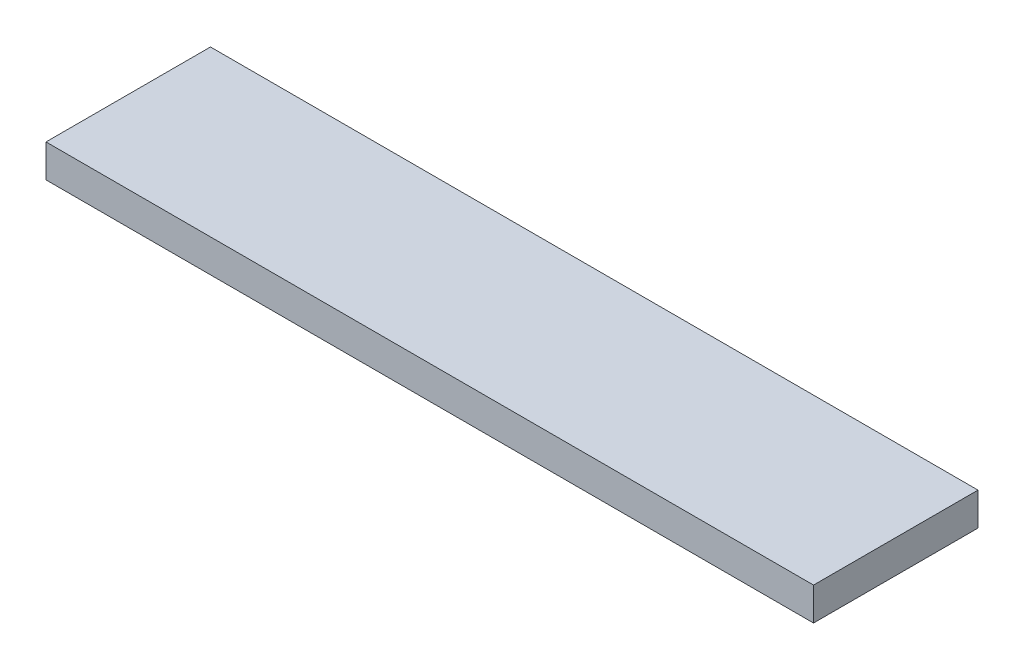
ISO-10303-21;
HEADER;
FILE_DESCRIPTION(('STEP AP214'),'2;1');
FILE_NAME('part.step','',(''),(''),'','','');
FILE_SCHEMA(('AUTOMOTIVE_DESIGN { 1 0 10303 214 1 1 1 1 }'));
ENDSEC;
DATA;
#1=APPLICATION_CONTEXT('core data for automotive mechanical design processes');
#2=APPLICATION_PROTOCOL_DEFINITION('international standard','automotive_design',2000,#1);
#3=PRODUCT_CONTEXT('',#1,'mechanical');
#4=PRODUCT('Part','Part','',(#3));
#5=PRODUCT_RELATED_PRODUCT_CATEGORY('part','',(#4));
#6=PRODUCT_DEFINITION_FORMATION('','',#4);
#7=PRODUCT_DEFINITION_CONTEXT('part definition',#1,'design');
#8=PRODUCT_DEFINITION('design','',#6,#7);
#9=PRODUCT_DEFINITION_SHAPE('','',#8);
#10=(LENGTH_UNIT() NAMED_UNIT(*) SI_UNIT(.MILLI.,.METRE.));
#11=(NAMED_UNIT(*) PLANE_ANGLE_UNIT() SI_UNIT($,.RADIAN.));
#12=(NAMED_UNIT(*) SI_UNIT($,.STERADIAN.) SOLID_ANGLE_UNIT());
#13=UNCERTAINTY_MEASURE_WITH_UNIT(LENGTH_MEASURE(1.E-05),#10,'distance_accuracy_value','');
#14=(GEOMETRIC_REPRESENTATION_CONTEXT(3) GLOBAL_UNCERTAINTY_ASSIGNED_CONTEXT((#13)) GLOBAL_UNIT_ASSIGNED_CONTEXT((#10,
#11,#12)) REPRESENTATION_CONTEXT('',''));
#15=CARTESIAN_POINT('',(0.,0.,0.));
#16=DIRECTION('',(0.,0.,1.));
#17=DIRECTION('',(1.,0.,0.));
#18=AXIS2_PLACEMENT_3D('',#15,#16,#17);
#19=CARTESIAN_POINT('',(175.,15.,-37.5));
#20=DIRECTION('',(-1.,0.,0.));
#21=DIRECTION('',(0.,0.,1.));
#22=AXIS2_PLACEMENT_3D('',#19,#20,#21);
#23=PLANE('',#22);
#24=DIRECTION('',(0.,0.,-1.));
#25=VECTOR('',#24,1.);
#26=CARTESIAN_POINT('',(175.,0.,-37.5));
#27=LINE('',#26,#25);
#28=CARTESIAN_POINT('',(175.,0.,37.5));
#29=VERTEX_POINT('',#28);
#30=CARTESIAN_POINT('',(175.,0.,-37.5));
#31=VERTEX_POINT('',#30);
#32=EDGE_CURVE('E107',#29,#31,#27,.T.);
#33=ORIENTED_EDGE('',*,*,#32,.T.);
#34=DIRECTION('',(0.,-1.,0.));
#35=VECTOR('',#34,1.);
#36=CARTESIAN_POINT('',(175.,15.,-37.5));
#37=LINE('',#36,#35);
#38=CARTESIAN_POINT('',(175.,15.,-37.5));
#39=VERTEX_POINT('',#38);
#40=EDGE_CURVE('E11',#39,#31,#37,.T.);
#41=ORIENTED_EDGE('',*,*,#40,.F.);
#42=DIRECTION('',(0.,0.,-1.));
#43=VECTOR('',#42,1.);
#44=CARTESIAN_POINT('',(175.,15.,-37.5));
#45=LINE('',#44,#43);
#46=CARTESIAN_POINT('',(175.,15.,37.5));
#47=VERTEX_POINT('',#46);
#48=EDGE_CURVE('E91',#47,#39,#45,.T.);
#49=ORIENTED_EDGE('',*,*,#48,.F.);
#50=DIRECTION('',(0.,-1.,0.));
#51=VECTOR('',#50,1.);
#52=CARTESIAN_POINT('',(175.,15.,37.5));
#53=LINE('',#52,#51);
#54=EDGE_CURVE('E103',#47,#29,#53,.T.);
#55=ORIENTED_EDGE('',*,*,#54,.T.);
#56=EDGE_LOOP('',(#33,#41,#49,#55));
#57=FACE_BOUND('',#56,.T.);
#58=ADVANCED_FACE('F39',(#57),#23,.F.);
#59=CARTESIAN_POINT('',(-175.,15.,-37.5));
#60=DIRECTION('',(0.,0.,1.));
#61=DIRECTION('',(1.,0.,0.));
#62=AXIS2_PLACEMENT_3D('',#59,#60,#61);
#63=PLANE('',#62);
#64=DIRECTION('',(-1.,0.,0.));
#65=VECTOR('',#64,1.);
#66=CARTESIAN_POINT('',(-175.,0.,-37.5));
#67=LINE('',#66,#65);
#68=CARTESIAN_POINT('',(-175.,0.,-37.5));
#69=VERTEX_POINT('',#68);
#70=EDGE_CURVE('E96',#31,#69,#67,.T.);
#71=ORIENTED_EDGE('',*,*,#70,.T.);
#72=DIRECTION('',(0.,-1.,0.));
#73=VECTOR('',#72,1.);
#74=CARTESIAN_POINT('',(-175.,15.,-37.5));
#75=LINE('',#74,#73);
#76=CARTESIAN_POINT('',(-175.,15.,-37.5));
#77=VERTEX_POINT('',#76);
#78=EDGE_CURVE('E48',#77,#69,#75,.T.);
#79=ORIENTED_EDGE('',*,*,#78,.F.);
#80=DIRECTION('',(-1.,0.,0.));
#81=VECTOR('',#80,1.);
#82=CARTESIAN_POINT('',(-175.,15.,-37.5));
#83=LINE('',#82,#81);
#84=EDGE_CURVE('E86',#39,#77,#83,.T.);
#85=ORIENTED_EDGE('',*,*,#84,.F.);
#86=ORIENTED_EDGE('',*,*,#40,.T.);
#87=EDGE_LOOP('',(#71,#79,#85,#86));
#88=FACE_BOUND('',#87,.T.);
#89=ADVANCED_FACE('F95',(#88),#63,.F.);
#90=CARTESIAN_POINT('',(-175.,15.,-37.5));
#91=DIRECTION('',(1.,0.,0.));
#92=DIRECTION('',(0.,0.,-1.));
#93=AXIS2_PLACEMENT_3D('',#90,#91,#92);
#94=PLANE('',#93);
#95=DIRECTION('',(0.,0.,1.));
#96=VECTOR('',#95,1.);
#97=CARTESIAN_POINT('',(-175.,0.,-37.5));
#98=LINE('',#97,#96);
#99=CARTESIAN_POINT('',(-175.,0.,37.5));
#100=VERTEX_POINT('',#99);
#101=EDGE_CURVE('E73',#69,#100,#98,.T.);
#102=ORIENTED_EDGE('',*,*,#101,.T.);
#103=DIRECTION('',(0.,-1.,0.));
#104=VECTOR('',#103,1.);
#105=CARTESIAN_POINT('',(-175.,15.,37.5));
#106=LINE('',#105,#104);
#107=CARTESIAN_POINT('',(-175.,15.,37.5));
#108=VERTEX_POINT('',#107);
#109=EDGE_CURVE('E98',#108,#100,#106,.T.);
#110=ORIENTED_EDGE('',*,*,#109,.F.);
#111=DIRECTION('',(0.,0.,1.));
#112=VECTOR('',#111,1.);
#113=CARTESIAN_POINT('',(-175.,15.,-37.5));
#114=LINE('',#113,#112);
#115=EDGE_CURVE('E89',#77,#108,#114,.T.);
#116=ORIENTED_EDGE('',*,*,#115,.F.);
#117=ORIENTED_EDGE('',*,*,#78,.T.);
#118=EDGE_LOOP('',(#102,#110,#116,#117));
#119=FACE_BOUND('',#118,.T.);
#120=ADVANCED_FACE('F99',(#119),#94,.F.);
#121=CARTESIAN_POINT('',(-175.,15.,37.5));
#122=DIRECTION('',(0.,0.,-1.));
#123=DIRECTION('',(-1.,0.,0.));
#124=AXIS2_PLACEMENT_3D('',#121,#122,#123);
#125=PLANE('',#124);
#126=DIRECTION('',(1.,0.,0.));
#127=VECTOR('',#126,1.);
#128=CARTESIAN_POINT('',(-175.,0.,37.5));
#129=LINE('',#128,#127);
#130=EDGE_CURVE('E79',#100,#29,#129,.T.);
#131=ORIENTED_EDGE('',*,*,#130,.T.);
#132=ORIENTED_EDGE('',*,*,#54,.F.);
#133=DIRECTION('',(1.,0.,0.));
#134=VECTOR('',#133,1.);
#135=CARTESIAN_POINT('',(-175.,15.,37.5));
#136=LINE('',#135,#134);
#137=EDGE_CURVE('E56',#108,#47,#136,.T.);
#138=ORIENTED_EDGE('',*,*,#137,.F.);
#139=ORIENTED_EDGE('',*,*,#109,.T.);
#140=EDGE_LOOP('',(#131,#132,#138,#139));
#141=FACE_BOUND('',#140,.T.);
#142=ADVANCED_FACE('F120',(#141),#125,.F.);
#143=CARTESIAN_POINT('',(0.,15.,0.));
#144=DIRECTION('',(0.,1.,0.));
#145=DIRECTION('',(0.,0.,1.));
#146=AXIS2_PLACEMENT_3D('',#143,#144,#145);
#147=PLANE('',#146);
#148=ORIENTED_EDGE('',*,*,#48,.T.);
#149=ORIENTED_EDGE('',*,*,#84,.T.);
#150=ORIENTED_EDGE('',*,*,#115,.T.);
#151=ORIENTED_EDGE('',*,*,#137,.T.);
#152=EDGE_LOOP('',(#148,#149,#150,#151));
#153=FACE_BOUND('',#152,.T.);
#154=ADVANCED_FACE('F87',(#153),#147,.T.);
#155=CARTESIAN_POINT('',(0.,0.,0.));
#156=DIRECTION('',(0.,1.,0.));
#157=DIRECTION('',(0.,0.,1.));
#158=AXIS2_PLACEMENT_3D('',#155,#156,#157);
#159=PLANE('',#158);
#160=ORIENTED_EDGE('',*,*,#32,.F.);
#161=ORIENTED_EDGE('',*,*,#130,.F.);
#162=ORIENTED_EDGE('',*,*,#101,.F.);
#163=ORIENTED_EDGE('',*,*,#70,.F.);
#164=EDGE_LOOP('',(#160,#161,#162,#163));
#165=FACE_BOUND('',#164,.T.);
#166=ADVANCED_FACE('F123',(#165),#159,.F.);
#167=CLOSED_SHELL('',(#58,#89,#120,#142,#154,#166));
#168=MANIFOLD_SOLID_BREP('B2',#167);
#169=ADVANCED_BREP_SHAPE_REPRESENTATION('',(#18,#168),#14);
#170=SHAPE_DEFINITION_REPRESENTATION(#9,#169);
ENDSEC;
END-ISO-10303-21;
